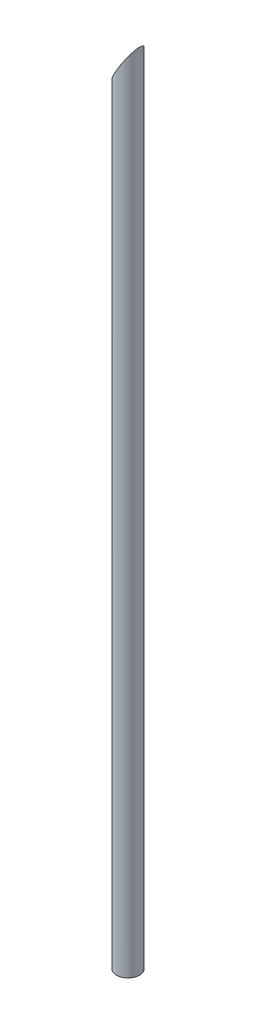
ISO-10303-21;
HEADER;
FILE_DESCRIPTION(('STEP AP214'),'2;1');
FILE_NAME('part.step','',(''),(''),'','','');
FILE_SCHEMA(('AUTOMOTIVE_DESIGN { 1 0 10303 214 1 1 1 1 }'));
ENDSEC;
DATA;
#1=APPLICATION_CONTEXT('core data for automotive mechanical design processes');
#2=APPLICATION_PROTOCOL_DEFINITION('international standard','automotive_design',2000,#1);
#3=PRODUCT_CONTEXT('',#1,'mechanical');
#4=PRODUCT('Part','Part','',(#3));
#5=PRODUCT_RELATED_PRODUCT_CATEGORY('part','',(#4));
#6=PRODUCT_DEFINITION_FORMATION('','',#4);
#7=PRODUCT_DEFINITION_CONTEXT('part definition',#1,'design');
#8=PRODUCT_DEFINITION('design','',#6,#7);
#9=PRODUCT_DEFINITION_SHAPE('','',#8);
#10=(LENGTH_UNIT() NAMED_UNIT(*) SI_UNIT(.MILLI.,.METRE.));
#11=(NAMED_UNIT(*) PLANE_ANGLE_UNIT() SI_UNIT($,.RADIAN.));
#12=(NAMED_UNIT(*) SI_UNIT($,.STERADIAN.) SOLID_ANGLE_UNIT());
#13=UNCERTAINTY_MEASURE_WITH_UNIT(LENGTH_MEASURE(1.E-05),#10,'distance_accuracy_value','');
#14=(GEOMETRIC_REPRESENTATION_CONTEXT(3) GLOBAL_UNCERTAINTY_ASSIGNED_CONTEXT((#13)) GLOBAL_UNIT_ASSIGNED_CONTEXT((#10,
#11,#12)) REPRESENTATION_CONTEXT('',''));
#15=CARTESIAN_POINT('',(0.,0.,0.));
#16=DIRECTION('',(0.,0.,1.));
#17=DIRECTION('',(1.,0.,0.));
#18=AXIS2_PLACEMENT_3D('',#15,#16,#17);
#19=CARTESIAN_POINT('',(0.,1168.4,0.));
#20=DIRECTION('',(0.,-1.,0.));
#21=DIRECTION('',(0.,0.,-1.));
#22=AXIS2_PLACEMENT_3D('',#19,#20,#21);
#23=CYLINDRICAL_SURFACE('',#22,16.7005);
#24=CARTESIAN_POINT('',(0.,0.,0.));
#25=DIRECTION('',(0.,1.,0.));
#26=DIRECTION('',(0.,0.,1.));
#27=AXIS2_PLACEMENT_3D('',#24,#25,#26);
#28=CIRCLE('',#27,16.7005);
#29=CARTESIAN_POINT('',(0.,0.,16.7005));
#30=VERTEX_POINT('',#29);
#31=EDGE_CURVE('E10',#30,#30,#28,.T.);
#32=ORIENTED_EDGE('',*,*,#31,.T.);
#33=EDGE_LOOP('',(#32));
#34=FACE_BOUND('',#33,.T.);
#35=CARTESIAN_POINT('',(0.,1139.4738854882,0.));
#36=DIRECTION('',(-0.86602540378444,0.499999999999998,0.));
#37=DIRECTION('',(-0.499999999999998,-0.86602540378444,0.));
#38=AXIS2_PLACEMENT_3D('',#35,#36,#37);
#39=ELLIPSE('',#38,33.4010000000001,16.7005);
#40=CARTESIAN_POINT('',(-16.7005,1110.54777097639,0.));
#41=VERTEX_POINT('',#40);
#42=EDGE_CURVE('E54',#41,#41,#39,.T.);
#43=ORIENTED_EDGE('',*,*,#42,.F.);
#44=EDGE_LOOP('',(#43));
#45=FACE_BOUND('',#44,.T.);
#46=ADVANCED_FACE('F40',(#34,#45),#23,.T.);
#47=CARTESIAN_POINT('',(0.,1168.4,0.));
#48=DIRECTION('',(0.,-1.,0.));
#49=DIRECTION('',(0.,0.,-1.));
#50=AXIS2_PLACEMENT_3D('',#47,#48,#49);
#51=CYLINDRICAL_SURFACE('',#50,13.3223);
#52=CARTESIAN_POINT('',(0.,0.,0.));
#53=DIRECTION('',(0.,1.,0.));
#54=DIRECTION('',(0.,0.,1.));
#55=AXIS2_PLACEMENT_3D('',#52,#53,#54);
#56=CIRCLE('',#55,13.3223);
#57=CARTESIAN_POINT('',(0.,0.,13.3223));
#58=VERTEX_POINT('',#57);
#59=EDGE_CURVE('E48',#58,#58,#56,.T.);
#60=ORIENTED_EDGE('',*,*,#59,.F.);
#61=EDGE_LOOP('',(#60));
#62=FACE_BOUND('',#61,.T.);
#63=CARTESIAN_POINT('',(0.,1139.4738854882,0.));
#64=DIRECTION('',(-0.86602540378444,0.499999999999998,0.));
#65=DIRECTION('',(-0.499999999999998,-0.86602540378444,0.));
#66=AXIS2_PLACEMENT_3D('',#63,#64,#65);
#67=ELLIPSE('',#66,26.6446000000001,13.3223);
#68=CARTESIAN_POINT('',(-13.3223,1116.39898501452,0.));
#69=VERTEX_POINT('',#68);
#70=EDGE_CURVE('E43',#69,#69,#67,.T.);
#71=ORIENTED_EDGE('',*,*,#70,.T.);
#72=EDGE_LOOP('',(#71));
#73=FACE_BOUND('',#72,.T.);
#74=ADVANCED_FACE('F67',(#62,#73),#51,.F.);
#75=CARTESIAN_POINT('',(0.,0.,0.));
#76=DIRECTION('',(0.,1.,0.));
#77=DIRECTION('',(0.,0.,1.));
#78=AXIS2_PLACEMENT_3D('',#75,#76,#77);
#79=PLANE('',#78);
#80=ORIENTED_EDGE('',*,*,#31,.F.);
#81=EDGE_LOOP('',(#80));
#82=FACE_BOUND('',#81,.T.);
#83=ORIENTED_EDGE('',*,*,#59,.T.);
#84=EDGE_LOOP('',(#83));
#85=FACE_BOUND('',#84,.T.);
#86=ADVANCED_FACE('F71',(#82,#85),#79,.F.);
#87=CARTESIAN_POINT('',(-493.406665890868,284.868471372047,-16.7005));
#88=DIRECTION('',(-0.86602540378444,0.499999999999998,0.));
#89=DIRECTION('',(-0.499999999999998,-0.86602540378444,0.));
#90=AXIS2_PLACEMENT_3D('',#87,#88,#89);
#91=PLANE('',#90);
#92=ORIENTED_EDGE('',*,*,#70,.F.);
#93=EDGE_LOOP('',(#92));
#94=FACE_BOUND('',#93,.T.);
#95=ORIENTED_EDGE('',*,*,#42,.T.);
#96=EDGE_LOOP('',(#95));
#97=FACE_BOUND('',#96,.T.);
#98=ADVANCED_FACE('F69',(#94,#97),#91,.T.);
#99=CLOSED_SHELL('',(#46,#74,#86,#98));
#100=MANIFOLD_SOLID_BREP('B2',#99);
#101=ADVANCED_BREP_SHAPE_REPRESENTATION('',(#18,#100),#14);
#102=SHAPE_DEFINITION_REPRESENTATION(#9,#101);
ENDSEC;
END-ISO-10303-21;
